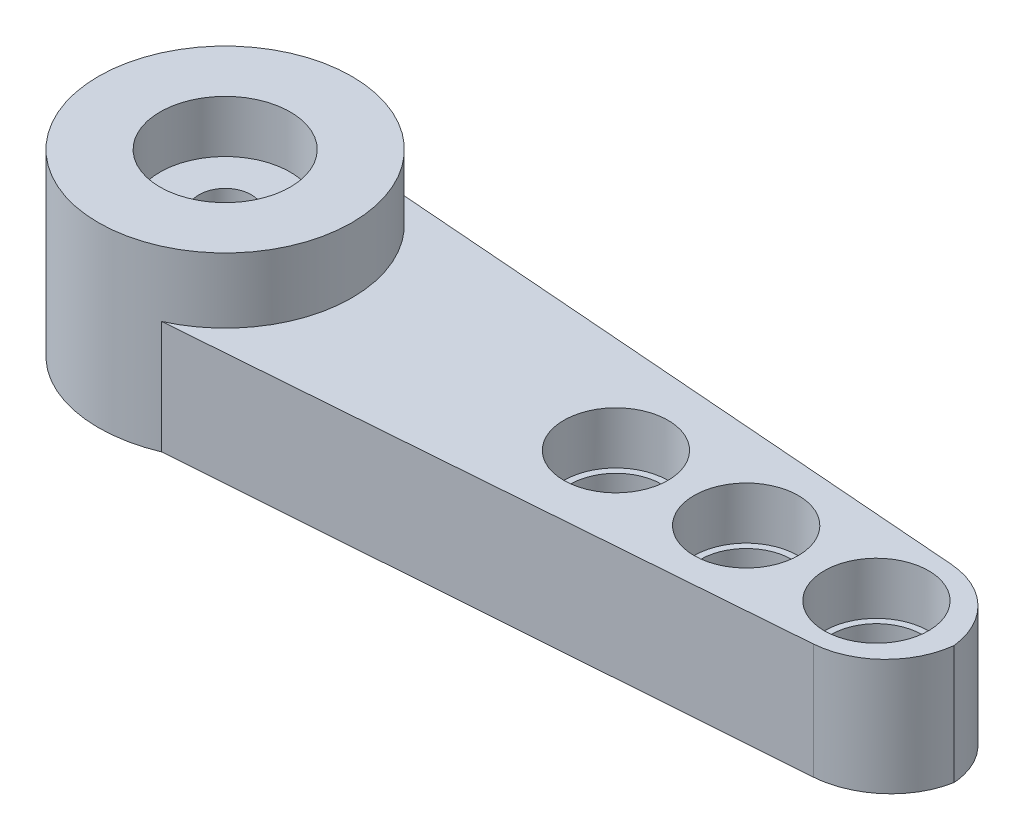
ISO-10303-21;
HEADER;
FILE_DESCRIPTION(('STEP AP214'),'2;1');
FILE_NAME('part.step','',(''),(''),'','','');
FILE_SCHEMA(('AUTOMOTIVE_DESIGN { 1 0 10303 214 1 1 1 1 }'));
ENDSEC;
DATA;
#1=APPLICATION_CONTEXT('core data for automotive mechanical design processes');
#2=APPLICATION_PROTOCOL_DEFINITION('international standard','automotive_design',2000,#1);
#3=PRODUCT_CONTEXT('',#1,'mechanical');
#4=PRODUCT('Part','Part','',(#3));
#5=PRODUCT_RELATED_PRODUCT_CATEGORY('part','',(#4));
#6=PRODUCT_DEFINITION_FORMATION('','',#4);
#7=PRODUCT_DEFINITION_CONTEXT('part definition',#1,'design');
#8=PRODUCT_DEFINITION('design','',#6,#7);
#9=PRODUCT_DEFINITION_SHAPE('','',#8);
#10=(LENGTH_UNIT() NAMED_UNIT(*) SI_UNIT(.MILLI.,.METRE.));
#11=(NAMED_UNIT(*) PLANE_ANGLE_UNIT() SI_UNIT($,.RADIAN.));
#12=(NAMED_UNIT(*) SI_UNIT($,.STERADIAN.) SOLID_ANGLE_UNIT());
#13=UNCERTAINTY_MEASURE_WITH_UNIT(LENGTH_MEASURE(1.E-05),#10,'distance_accuracy_value','');
#14=(GEOMETRIC_REPRESENTATION_CONTEXT(3) GLOBAL_UNCERTAINTY_ASSIGNED_CONTEXT((#13)) GLOBAL_UNIT_ASSIGNED_CONTEXT((#10,
#11,#12)) REPRESENTATION_CONTEXT('',''));
#15=CARTESIAN_POINT('',(0.,0.,0.));
#16=DIRECTION('',(0.,0.,1.));
#17=DIRECTION('',(1.,0.,0.));
#18=AXIS2_PLACEMENT_3D('',#15,#16,#17);
#19=CARTESIAN_POINT('',(0.,3.9,0.));
#20=DIRECTION('',(0.,-1.,0.));
#21=DIRECTION('',(0.,0.,-1.));
#22=AXIS2_PLACEMENT_3D('',#19,#20,#21);
#23=CYLINDRICAL_SURFACE('',#22,1.);
#24=CARTESIAN_POINT('',(0.,1.9,0.));
#25=DIRECTION('',(0.,1.,0.));
#26=DIRECTION('',(0.,0.,1.));
#27=AXIS2_PLACEMENT_3D('',#24,#25,#26);
#28=CIRCLE('',#27,1.);
#29=CARTESIAN_POINT('',(0.,1.9,1.));
#30=VERTEX_POINT('',#29);
#31=EDGE_CURVE('E39',#30,#30,#28,.T.);
#32=ORIENTED_EDGE('',*,*,#31,.T.);
#33=EDGE_LOOP('',(#32));
#34=FACE_BOUND('',#33,.T.);
#35=CARTESIAN_POINT('',(0.,-1.,0.));
#36=DIRECTION('',(0.,-1.,0.));
#37=DIRECTION('',(0.,0.,-1.));
#38=AXIS2_PLACEMENT_3D('',#35,#36,#37);
#39=CIRCLE('',#38,1.);
#40=CARTESIAN_POINT('',(0.,-1.,-1.));
#41=VERTEX_POINT('',#40);
#42=EDGE_CURVE('E468',#41,#41,#39,.T.);
#43=ORIENTED_EDGE('',*,*,#42,.T.);
#44=EDGE_LOOP('',(#43));
#45=FACE_BOUND('',#44,.T.);
#46=ADVANCED_FACE('F35',(#34,#45),#23,.F.);
#47=CARTESIAN_POINT('',(0.,1.,0.));
#48=DIRECTION('',(0.,-1.,0.));
#49=DIRECTION('',(0.,0.,-1.));
#50=AXIS2_PLACEMENT_3D('',#47,#48,#49);
#51=CYLINDRICAL_SURFACE('',#50,2.6);
#52=CARTESIAN_POINT('',(0.,-1.,0.));
#53=DIRECTION('',(0.,-1.,0.));
#54=DIRECTION('',(0.,0.,-1.));
#55=AXIS2_PLACEMENT_3D('',#52,#53,#54);
#56=CIRCLE('',#55,2.6);
#57=CARTESIAN_POINT('',(0.,-1.,-2.6));
#58=VERTEX_POINT('',#57);
#59=EDGE_CURVE('E128',#58,#58,#56,.T.);
#60=ORIENTED_EDGE('',*,*,#59,.F.);
#61=EDGE_LOOP('',(#60));
#62=FACE_BOUND('',#61,.T.);
#63=CARTESIAN_POINT('',(0.,-3.15474202909361,0.));
#64=DIRECTION('',(0.,-0.998806137341434,0.0488497697956134));
#65=DIRECTION('',(0.,-0.0488497697956134,-0.998806137341434));
#66=AXIS2_PLACEMENT_3D('',#63,#64,#65);
#67=ELLIPSE('',#66,2.6031077531427,2.6);
#68=CARTESIAN_POINT('',(0.,-3.28190324358781,-2.6));
#69=VERTEX_POINT('',#68);
#70=EDGE_CURVE('E141',#69,#69,#67,.F.);
#71=ORIENTED_EDGE('',*,*,#70,.F.);
#72=EDGE_LOOP('',(#71));
#73=FACE_BOUND('',#72,.T.);
#74=ADVANCED_FACE('F199',(#62,#73),#51,.F.);
#75=CARTESIAN_POINT('',(0.,17.0446470101297,0.));
#76=DIRECTION('',(0.,-1.,0.));
#77=DIRECTION('',(0.,0.,-1.));
#78=AXIS2_PLACEMENT_3D('',#75,#76,#77);
#79=CYLINDRICAL_SURFACE('',#78,4.86502338951349);
#80=CARTESIAN_POINT('',(0.,-3.15474202909361,0.));
#81=DIRECTION('',(0.,-0.998806137341434,0.0488497697956134));
#82=DIRECTION('',(0.,-0.0488497697956134,-0.998806137341434));
#83=AXIS2_PLACEMENT_3D('',#80,#81,#82);
#84=ELLIPSE('',#83,4.87083850171659,4.86502338951349);
#85=CARTESIAN_POINT('',(1.99999999999999,-3.37164545705108,-4.43491291690302));
#86=VERTEX_POINT('',#85);
#87=CARTESIAN_POINT('',(2.,-2.93783860113616,4.43491291690302));
#88=VERTEX_POINT('',#87);
#89=EDGE_CURVE('E138',#86,#88,#84,.F.);
#90=ORIENTED_EDGE('',*,*,#89,.T.);
#91=DIRECTION('',(0.,-1.,0.));
#92=VECTOR('',#91,1.);
#93=CARTESIAN_POINT('',(2.,28.871327057899,4.43491291690302));
#94=LINE('',#93,#92);
#95=CARTESIAN_POINT('',(2.,1.4,4.43491291690302));
#96=VERTEX_POINT('',#95);
#97=EDGE_CURVE('E158',#96,#88,#94,.T.);
#98=ORIENTED_EDGE('',*,*,#97,.F.);
#99=CARTESIAN_POINT('',(0.,1.4,0.));
#100=DIRECTION('',(0.,1.,0.));
#101=DIRECTION('',(0.,0.,1.));
#102=AXIS2_PLACEMENT_3D('',#99,#100,#101);
#103=CIRCLE('',#102,4.86502338951349);
#104=CARTESIAN_POINT('',(2.,1.4,-4.43491291690302));
#105=VERTEX_POINT('',#104);
#106=EDGE_CURVE('E164',#105,#96,#103,.F.);
#107=ORIENTED_EDGE('',*,*,#106,.F.);
#108=DIRECTION('',(0.,-1.,0.));
#109=VECTOR('',#108,1.);
#110=CARTESIAN_POINT('',(2.,28.871327057899,-4.43491291690302));
#111=LINE('',#110,#109);
#112=EDGE_CURVE('E162',#105,#86,#111,.T.);
#113=ORIENTED_EDGE('',*,*,#112,.T.);
#114=EDGE_LOOP('',(#90,#98,#107,#113));
#115=FACE_BOUND('',#114,.T.);
#116=CARTESIAN_POINT('',(0.,3.9,0.));
#117=DIRECTION('',(0.,1.,0.));
#118=DIRECTION('',(0.,0.,1.));
#119=AXIS2_PLACEMENT_3D('',#116,#117,#118);
#120=CIRCLE('',#119,4.86502338951349);
#121=CARTESIAN_POINT('',(0.,3.9,4.86502338951349));
#122=VERTEX_POINT('',#121);
#123=EDGE_CURVE('E168',#122,#122,#120,.F.);
#124=ORIENTED_EDGE('',*,*,#123,.T.);
#125=EDGE_LOOP('',(#124));
#126=FACE_BOUND('',#125,.T.);
#127=ADVANCED_FACE('F187',(#115,#126),#79,.T.);
#128=CARTESIAN_POINT('',(2.,28.871327057899,4.43491291690302));
#129=DIRECTION('',(0.076696498884737,0.,0.997054485501582));
#130=DIRECTION('',(0.997054485501582,0.,-0.076696498884737));
#131=AXIS2_PLACEMENT_3D('',#128,#129,#130);
#132=PLANE('',#131);
#133=ORIENTED_EDGE('',*,*,#97,.T.);
#134=DIRECTION('',(0.997047470980419,-0.00375105820468159,-0.0766959593061861));
#135=VECTOR('',#134,1.);
#136=CARTESIAN_POINT('',(1.88103425812214,-2.9373910322539,4.44406412781671));
#137=LINE('',#136,#135);
#138=CARTESIAN_POINT('',(25.2300894966542,-3.02523405655638,2.64798295562193));
#139=VERTEX_POINT('',#138);
#140=EDGE_CURVE('E136',#88,#139,#137,.T.);
#141=ORIENTED_EDGE('',*,*,#140,.T.);
#142=DIRECTION('',(0.,-1.,0.));
#143=VECTOR('',#142,1.);
#144=CARTESIAN_POINT('',(25.2300894966542,28.871327057899,2.64798295562193));
#145=LINE('',#144,#143);
#146=CARTESIAN_POINT('',(25.2300894966542,1.4,2.64798295562193));
#147=VERTEX_POINT('',#146);
#148=EDGE_CURVE('E11',#139,#147,#145,.F.);
#149=ORIENTED_EDGE('',*,*,#148,.T.);
#150=DIRECTION('',(-0.997054485501582,0.,0.076696498884737));
#151=VECTOR('',#150,1.);
#152=CARTESIAN_POINT('',(2.,1.4,4.43491291690302));
#153=LINE('',#152,#151);
#154=EDGE_CURVE('E155',#147,#96,#153,.T.);
#155=ORIENTED_EDGE('',*,*,#154,.T.);
#156=EDGE_LOOP('',(#133,#141,#149,#155));
#157=FACE_BOUND('',#156,.T.);
#158=ADVANCED_FACE('F191',(#157),#132,.T.);
#159=CARTESIAN_POINT('',(28.,28.871327057899,-2.43491291690302));
#160=DIRECTION('',(0.076696498884737,0.,-0.997054485501582));
#161=DIRECTION('',(-0.997054485501582,0.,-0.076696498884737));
#162=AXIS2_PLACEMENT_3D('',#159,#160,#161);
#163=PLANE('',#162);
#164=DIRECTION('',(0.,-1.,0.));
#165=VECTOR('',#164,1.);
#166=CARTESIAN_POINT('',(25.2300894966542,28.871327057899,-2.64798295562193));
#167=LINE('',#166,#165);
#168=CARTESIAN_POINT('',(25.2300894966542,1.4,-2.64798295562193));
#169=VERTEX_POINT('',#168);
#170=CARTESIAN_POINT('',(25.2300894966542,-3.28425000163086,-2.64798295562193));
#171=VERTEX_POINT('',#170);
#172=EDGE_CURVE('E171',#169,#171,#167,.T.);
#173=ORIENTED_EDGE('',*,*,#172,.T.);
#174=DIRECTION('',(-0.997047470980419,-0.00375105820468159,-0.0766959593061861));
#175=VECTOR('',#174,1.);
#176=CARTESIAN_POINT('',(28.1202223408071,-3.27337684179322,-2.42566504453325));
#177=LINE('',#176,#175);
#178=EDGE_CURVE('E52',#171,#86,#177,.T.);
#179=ORIENTED_EDGE('',*,*,#178,.T.);
#180=ORIENTED_EDGE('',*,*,#112,.F.);
#181=DIRECTION('',(0.997054485501582,0.,0.076696498884737));
#182=VECTOR('',#181,1.);
#183=CARTESIAN_POINT('',(28.,1.4,-2.43491291690302));
#184=LINE('',#183,#182);
#185=EDGE_CURVE('E159',#105,#169,#184,.T.);
#186=ORIENTED_EDGE('',*,*,#185,.T.);
#187=EDGE_LOOP('',(#173,#179,#180,#186));
#188=FACE_BOUND('',#187,.T.);
#189=ADVANCED_FACE('F185',(#188),#163,.T.);
#190=CARTESIAN_POINT('',(25.,28.871327057899,-0.343180500882815));
#191=DIRECTION('',(0.,-1.,0.));
#192=DIRECTION('',(0.,0.,-1.));
#193=AXIS2_PLACEMENT_3D('',#190,#191,#192);
#194=CYLINDRICAL_SURFACE('',#193,3.);
#195=ORIENTED_EDGE('',*,*,#148,.F.);
#196=CARTESIAN_POINT('',(25.,-3.17152635574093,-0.343180500882815));
#197=DIRECTION('',(0.,-0.998806137341434,0.0488497697956134));
#198=DIRECTION('',(0.,-0.0488497697956134,-0.998806137341434));
#199=AXIS2_PLACEMENT_3D('',#196,#197,#198);
#200=ELLIPSE('',#199,3.00358586901081,3.);
#201=CARTESIAN_POINT('',(27.9803065519865,-3.15474202909363,0.));
#202=VERTEX_POINT('',#201);
#203=EDGE_CURVE('E87',#139,#202,#200,.F.);
#204=ORIENTED_EDGE('',*,*,#203,.T.);
#205=DIRECTION('',(0.,-1.,0.));
#206=VECTOR('',#205,1.);
#207=CARTESIAN_POINT('',(27.9803065519865,0.400000000000001,0.));
#208=LINE('',#207,#206);
#209=CARTESIAN_POINT('',(27.9803065519865,1.4,0.));
#210=VERTEX_POINT('',#209);
#211=EDGE_CURVE('E97',#210,#202,#208,.T.);
#212=ORIENTED_EDGE('',*,*,#211,.F.);
#213=CARTESIAN_POINT('',(25.,1.4,-0.343180500882815));
#214=DIRECTION('',(0.,1.,0.));
#215=DIRECTION('',(0.,0.,1.));
#216=AXIS2_PLACEMENT_3D('',#213,#214,#215);
#217=CIRCLE('',#216,3.);
#218=EDGE_CURVE('E60',#147,#210,#217,.T.);
#219=ORIENTED_EDGE('',*,*,#218,.F.);
#220=EDGE_LOOP('',(#195,#204,#212,#219));
#221=FACE_BOUND('',#220,.T.);
#222=ADVANCED_FACE('F37',(#221),#194,.T.);
#223=CARTESIAN_POINT('',(25.,28.871327057899,0.343180500882815));
#224=DIRECTION('',(0.,-1.,0.));
#225=DIRECTION('',(0.,0.,-1.));
#226=AXIS2_PLACEMENT_3D('',#223,#224,#225);
#227=CYLINDRICAL_SURFACE('',#226,3.);
#228=ORIENTED_EDGE('',*,*,#211,.T.);
#229=CARTESIAN_POINT('',(25.,-3.13795770244632,0.343180500882815));
#230=DIRECTION('',(0.,-0.998806137341434,0.0488497697956134));
#231=DIRECTION('',(0.,-0.0488497697956134,-0.998806137341434));
#232=AXIS2_PLACEMENT_3D('',#229,#230,#231);
#233=ELLIPSE('',#232,3.00358586901081,3.);
#234=EDGE_CURVE('E82',#202,#171,#233,.F.);
#235=ORIENTED_EDGE('',*,*,#234,.T.);
#236=ORIENTED_EDGE('',*,*,#172,.F.);
#237=CARTESIAN_POINT('',(25.,1.4,0.343180500882815));
#238=DIRECTION('',(0.,1.,0.));
#239=DIRECTION('',(0.,0.,1.));
#240=AXIS2_PLACEMENT_3D('',#237,#238,#239);
#241=CIRCLE('',#240,3.);
#242=EDGE_CURVE('E44',#210,#169,#241,.T.);
#243=ORIENTED_EDGE('',*,*,#242,.F.);
#244=EDGE_LOOP('',(#228,#235,#236,#243));
#245=FACE_BOUND('',#244,.T.);
#246=ADVANCED_FACE('F100',(#245),#227,.T.);
#247=CARTESIAN_POINT('',(20.,-3.6,0.));
#248=DIRECTION('',(0.,1.,0.));
#249=DIRECTION('',(0.,0.,1.));
#250=AXIS2_PLACEMENT_3D('',#247,#248,#249);
#251=CYLINDRICAL_SURFACE('',#250,1.75);
#252=CARTESIAN_POINT('',(20.,-0.6,0.));
#253=DIRECTION('',(0.,-1.,0.));
#254=DIRECTION('',(0.,0.,-1.));
#255=AXIS2_PLACEMENT_3D('',#252,#253,#254);
#256=CIRCLE('',#255,1.75);
#257=CARTESIAN_POINT('',(20.,-0.6,-1.75));
#258=VERTEX_POINT('',#257);
#259=EDGE_CURVE('E102',#258,#258,#256,.T.);
#260=ORIENTED_EDGE('',*,*,#259,.F.);
#261=EDGE_LOOP('',(#260));
#262=FACE_BOUND('',#261,.T.);
#263=CARTESIAN_POINT('',(20.,-3.15474202909361,0.));
#264=DIRECTION('',(0.,-0.998806137341434,0.0488497697956134));
#265=DIRECTION('',(0.,0.0488497697956134,0.998806137341434));
#266=AXIS2_PLACEMENT_3D('',#263,#264,#265);
#267=ELLIPSE('',#266,1.75209175692297,1.75);
#268=CARTESIAN_POINT('',(20.,-3.06915275010714,1.75));
#269=VERTEX_POINT('',#268);
#270=EDGE_CURVE('E93',#269,#269,#267,.T.);
#271=ORIENTED_EDGE('',*,*,#270,.T.);
#272=EDGE_LOOP('',(#271));
#273=FACE_BOUND('',#272,.T.);
#274=ADVANCED_FACE('F219',(#262,#273),#251,.F.);
#275=CARTESIAN_POINT('',(15.,-3.6,0.));
#276=DIRECTION('',(0.,1.,0.));
#277=DIRECTION('',(0.,0.,1.));
#278=AXIS2_PLACEMENT_3D('',#275,#276,#277);
#279=CYLINDRICAL_SURFACE('',#278,1.75);
#280=CARTESIAN_POINT('',(15.,-0.6,0.));
#281=DIRECTION('',(0.,-1.,0.));
#282=DIRECTION('',(0.,0.,-1.));
#283=AXIS2_PLACEMENT_3D('',#280,#281,#282);
#284=CIRCLE('',#283,1.75);
#285=CARTESIAN_POINT('',(15.,-0.6,-1.75));
#286=VERTEX_POINT('',#285);
#287=EDGE_CURVE('E108',#286,#286,#284,.T.);
#288=ORIENTED_EDGE('',*,*,#287,.F.);
#289=EDGE_LOOP('',(#288));
#290=FACE_BOUND('',#289,.T.);
#291=CARTESIAN_POINT('',(15.,-3.15474202909361,0.));
#292=DIRECTION('',(0.,-0.998806137341434,0.0488497697956134));
#293=DIRECTION('',(0.,0.0488497697956134,0.998806137341434));
#294=AXIS2_PLACEMENT_3D('',#291,#292,#293);
#295=ELLIPSE('',#294,1.75209175692297,1.75);
#296=CARTESIAN_POINT('',(15.,-3.06915275010714,1.75));
#297=VERTEX_POINT('',#296);
#298=EDGE_CURVE('E113',#297,#297,#295,.T.);
#299=ORIENTED_EDGE('',*,*,#298,.T.);
#300=EDGE_LOOP('',(#299));
#301=FACE_BOUND('',#300,.T.);
#302=ADVANCED_FACE('F224',(#290,#301),#279,.F.);
#303=CARTESIAN_POINT('',(25.,-3.6,0.));
#304=DIRECTION('',(0.,1.,0.));
#305=DIRECTION('',(0.,0.,1.));
#306=AXIS2_PLACEMENT_3D('',#303,#304,#305);
#307=CYLINDRICAL_SURFACE('',#306,1.75);
#308=CARTESIAN_POINT('',(25.,-0.6,0.));
#309=DIRECTION('',(0.,-1.,0.));
#310=DIRECTION('',(0.,0.,-1.));
#311=AXIS2_PLACEMENT_3D('',#308,#309,#310);
#312=CIRCLE('',#311,1.75);
#313=CARTESIAN_POINT('',(25.,-0.6,-1.75));
#314=VERTEX_POINT('',#313);
#315=EDGE_CURVE('E144',#314,#314,#312,.T.);
#316=ORIENTED_EDGE('',*,*,#315,.F.);
#317=EDGE_LOOP('',(#316));
#318=FACE_BOUND('',#317,.T.);
#319=CARTESIAN_POINT('',(25.,-3.15474202909361,0.));
#320=DIRECTION('',(0.,-0.998806137341434,0.0488497697956134));
#321=DIRECTION('',(0.,0.0488497697956134,0.998806137341434));
#322=AXIS2_PLACEMENT_3D('',#319,#320,#321);
#323=ELLIPSE('',#322,1.75209175692297,1.75);
#324=CARTESIAN_POINT('',(25.,-3.06915275010714,1.75));
#325=VERTEX_POINT('',#324);
#326=EDGE_CURVE('E111',#325,#325,#323,.T.);
#327=ORIENTED_EDGE('',*,*,#326,.T.);
#328=EDGE_LOOP('',(#327));
#329=FACE_BOUND('',#328,.T.);
#330=ADVANCED_FACE('F217',(#318,#329),#307,.F.);
#331=CARTESIAN_POINT('',(-15.2,1.4,0.));
#332=DIRECTION('',(0.,1.,0.));
#333=DIRECTION('',(0.,0.,1.));
#334=AXIS2_PLACEMENT_3D('',#331,#332,#333);
#335=PLANE('',#334);
#336=ORIENTED_EDGE('',*,*,#106,.T.);
#337=ORIENTED_EDGE('',*,*,#154,.F.);
#338=ORIENTED_EDGE('',*,*,#218,.T.);
#339=ORIENTED_EDGE('',*,*,#242,.T.);
#340=ORIENTED_EDGE('',*,*,#185,.F.);
#341=EDGE_LOOP('',(#336,#337,#338,#339,#340));
#342=FACE_BOUND('',#341,.T.);
#343=CARTESIAN_POINT('',(15.,1.4,0.));
#344=DIRECTION('',(0.,1.,0.));
#345=DIRECTION('',(0.,0.,1.));
#346=AXIS2_PLACEMENT_3D('',#343,#344,#345);
#347=CIRCLE('',#346,2.);
#348=CARTESIAN_POINT('',(15.,1.4,2.));
#349=VERTEX_POINT('',#348);
#350=EDGE_CURVE('E149',#349,#349,#347,.F.);
#351=ORIENTED_EDGE('',*,*,#350,.T.);
#352=EDGE_LOOP('',(#351));
#353=FACE_BOUND('',#352,.T.);
#354=CARTESIAN_POINT('',(25.,1.4,0.));
#355=DIRECTION('',(0.,1.,0.));
#356=DIRECTION('',(0.,0.,1.));
#357=AXIS2_PLACEMENT_3D('',#354,#355,#356);
#358=CIRCLE('',#357,2.);
#359=CARTESIAN_POINT('',(25.,1.4,2.));
#360=VERTEX_POINT('',#359);
#361=EDGE_CURVE('E105',#360,#360,#358,.F.);
#362=ORIENTED_EDGE('',*,*,#361,.T.);
#363=EDGE_LOOP('',(#362));
#364=FACE_BOUND('',#363,.T.);
#365=CARTESIAN_POINT('',(20.,1.4,0.));
#366=DIRECTION('',(0.,1.,0.));
#367=DIRECTION('',(0.,0.,1.));
#368=AXIS2_PLACEMENT_3D('',#365,#366,#367);
#369=CIRCLE('',#368,2.);
#370=CARTESIAN_POINT('',(20.,1.4,2.));
#371=VERTEX_POINT('',#370);
#372=EDGE_CURVE('E101',#371,#371,#369,.F.);
#373=ORIENTED_EDGE('',*,*,#372,.T.);
#374=EDGE_LOOP('',(#373));
#375=FACE_BOUND('',#374,.T.);
#376=ADVANCED_FACE('F181',(#342,#353,#364,#375),#335,.T.);
#377=CARTESIAN_POINT('',(0.,3.9,0.));
#378=DIRECTION('',(0.,1.,0.));
#379=DIRECTION('',(0.,0.,1.));
#380=AXIS2_PLACEMENT_3D('',#377,#378,#379);
#381=PLANE('',#380);
#382=CARTESIAN_POINT('',(0.,3.9,0.));
#383=DIRECTION('',(0.,1.,0.));
#384=DIRECTION('',(0.,0.,1.));
#385=AXIS2_PLACEMENT_3D('',#382,#383,#384);
#386=CIRCLE('',#385,2.5);
#387=CARTESIAN_POINT('',(0.,3.9,2.5));
#388=VERTEX_POINT('',#387);
#389=EDGE_CURVE('E123',#388,#388,#386,.T.);
#390=ORIENTED_EDGE('',*,*,#389,.F.);
#391=EDGE_LOOP('',(#390));
#392=FACE_BOUND('',#391,.T.);
#393=ORIENTED_EDGE('',*,*,#123,.F.);
#394=EDGE_LOOP('',(#393));
#395=FACE_BOUND('',#394,.T.);
#396=ADVANCED_FACE('F211',(#392,#395),#381,.T.);
#397=CARTESIAN_POINT('',(20.,-10.6,0.));
#398=DIRECTION('',(0.,1.,0.));
#399=DIRECTION('',(0.,0.,1.));
#400=AXIS2_PLACEMENT_3D('',#397,#398,#399);
#401=CYLINDRICAL_SURFACE('',#400,2.);
#402=CARTESIAN_POINT('',(20.,-0.6,0.));
#403=DIRECTION('',(0.,-1.,0.));
#404=DIRECTION('',(0.,0.,-1.));
#405=AXIS2_PLACEMENT_3D('',#402,#403,#404);
#406=CIRCLE('',#405,2.);
#407=CARTESIAN_POINT('',(20.,-0.6,-2.));
#408=VERTEX_POINT('',#407);
#409=EDGE_CURVE('E152',#408,#408,#406,.F.);
#410=ORIENTED_EDGE('',*,*,#409,.F.);
#411=EDGE_LOOP('',(#410));
#412=FACE_BOUND('',#411,.T.);
#413=ORIENTED_EDGE('',*,*,#372,.F.);
#414=EDGE_LOOP('',(#413));
#415=FACE_BOUND('',#414,.T.);
#416=ADVANCED_FACE('F213',(#412,#415),#401,.F.);
#417=CARTESIAN_POINT('',(25.,-10.6,0.));
#418=DIRECTION('',(0.,1.,0.));
#419=DIRECTION('',(0.,0.,1.));
#420=AXIS2_PLACEMENT_3D('',#417,#418,#419);
#421=CYLINDRICAL_SURFACE('',#420,2.);
#422=CARTESIAN_POINT('',(25.,-0.6,0.));
#423=DIRECTION('',(0.,-1.,0.));
#424=DIRECTION('',(0.,0.,-1.));
#425=AXIS2_PLACEMENT_3D('',#422,#423,#424);
#426=CIRCLE('',#425,2.);
#427=CARTESIAN_POINT('',(25.,-0.6,-2.));
#428=VERTEX_POINT('',#427);
#429=EDGE_CURVE('E174',#428,#428,#426,.F.);
#430=ORIENTED_EDGE('',*,*,#429,.F.);
#431=EDGE_LOOP('',(#430));
#432=FACE_BOUND('',#431,.T.);
#433=ORIENTED_EDGE('',*,*,#361,.F.);
#434=EDGE_LOOP('',(#433));
#435=FACE_BOUND('',#434,.T.);
#436=ADVANCED_FACE('F315',(#432,#435),#421,.F.);
#437=CARTESIAN_POINT('',(15.,-10.6,0.));
#438=DIRECTION('',(0.,1.,0.));
#439=DIRECTION('',(0.,0.,1.));
#440=AXIS2_PLACEMENT_3D('',#437,#438,#439);
#441=CYLINDRICAL_SURFACE('',#440,2.);
#442=CARTESIAN_POINT('',(15.,-0.6,0.));
#443=DIRECTION('',(0.,-1.,0.));
#444=DIRECTION('',(0.,0.,-1.));
#445=AXIS2_PLACEMENT_3D('',#442,#443,#444);
#446=CIRCLE('',#445,2.);
#447=CARTESIAN_POINT('',(15.,-0.6,-2.));
#448=VERTEX_POINT('',#447);
#449=EDGE_CURVE('E166',#448,#448,#446,.F.);
#450=ORIENTED_EDGE('',*,*,#449,.F.);
#451=EDGE_LOOP('',(#450));
#452=FACE_BOUND('',#451,.T.);
#453=ORIENTED_EDGE('',*,*,#350,.F.);
#454=EDGE_LOOP('',(#453));
#455=FACE_BOUND('',#454,.T.);
#456=ADVANCED_FACE('F311',(#452,#455),#441,.F.);
#457=CARTESIAN_POINT('',(0.,-0.6,0.));
#458=DIRECTION('',(0.,-1.,0.));
#459=DIRECTION('',(0.,0.,-1.));
#460=AXIS2_PLACEMENT_3D('',#457,#458,#459);
#461=PLANE('',#460);
#462=ORIENTED_EDGE('',*,*,#287,.T.);
#463=EDGE_LOOP('',(#462));
#464=FACE_BOUND('',#463,.T.);
#465=ORIENTED_EDGE('',*,*,#449,.T.);
#466=EDGE_LOOP('',(#465));
#467=FACE_BOUND('',#466,.T.);
#468=ADVANCED_FACE('F307',(#464,#467),#461,.F.);
#469=ORIENTED_EDGE('',*,*,#315,.T.);
#470=EDGE_LOOP('',(#469));
#471=FACE_BOUND('',#470,.T.);
#472=ORIENTED_EDGE('',*,*,#429,.T.);
#473=EDGE_LOOP('',(#472));
#474=FACE_BOUND('',#473,.T.);
#475=ADVANCED_FACE('F310',(#471,#474),#461,.F.);
#476=ORIENTED_EDGE('',*,*,#259,.T.);
#477=EDGE_LOOP('',(#476));
#478=FACE_BOUND('',#477,.T.);
#479=ORIENTED_EDGE('',*,*,#409,.T.);
#480=EDGE_LOOP('',(#479));
#481=FACE_BOUND('',#480,.T.);
#482=ADVANCED_FACE('F300',(#478,#481),#461,.F.);
#483=CARTESIAN_POINT('',(0.,-3.14721386816093,0.153924437595509));
#484=DIRECTION('',(0.,-0.998806137341434,0.0488497697956134));
#485=DIRECTION('',(0.,-0.0488497697956134,-0.998806137341434));
#486=AXIS2_PLACEMENT_3D('',#483,#484,#485);
#487=PLANE('',#486);
#488=ORIENTED_EDGE('',*,*,#178,.F.);
#489=ORIENTED_EDGE('',*,*,#234,.F.);
#490=ORIENTED_EDGE('',*,*,#203,.F.);
#491=ORIENTED_EDGE('',*,*,#140,.F.);
#492=ORIENTED_EDGE('',*,*,#89,.F.);
#493=EDGE_LOOP('',(#488,#489,#490,#491,#492));
#494=FACE_BOUND('',#493,.T.);
#495=ORIENTED_EDGE('',*,*,#270,.F.);
#496=EDGE_LOOP('',(#495));
#497=FACE_BOUND('',#496,.T.);
#498=ORIENTED_EDGE('',*,*,#298,.F.);
#499=EDGE_LOOP('',(#498));
#500=FACE_BOUND('',#499,.T.);
#501=ORIENTED_EDGE('',*,*,#326,.F.);
#502=EDGE_LOOP('',(#501));
#503=FACE_BOUND('',#502,.T.);
#504=ORIENTED_EDGE('',*,*,#70,.T.);
#505=EDGE_LOOP('',(#504));
#506=FACE_BOUND('',#505,.T.);
#507=ADVANCED_FACE('F84',(#494,#497,#500,#503,#506),#487,.T.);
#508=CARTESIAN_POINT('',(0.,1.9,0.));
#509=DIRECTION('',(0.,1.,0.));
#510=DIRECTION('',(0.,0.,1.));
#511=AXIS2_PLACEMENT_3D('',#508,#509,#510);
#512=CYLINDRICAL_SURFACE('',#511,2.5);
#513=CARTESIAN_POINT('',(0.,1.9,0.));
#514=DIRECTION('',(0.,1.,0.));
#515=DIRECTION('',(0.,0.,1.));
#516=AXIS2_PLACEMENT_3D('',#513,#514,#515);
#517=CIRCLE('',#516,2.5);
#518=CARTESIAN_POINT('',(0.,1.9,2.5));
#519=VERTEX_POINT('',#518);
#520=EDGE_CURVE('E119',#519,#519,#517,.T.);
#521=ORIENTED_EDGE('',*,*,#520,.F.);
#522=EDGE_LOOP('',(#521));
#523=FACE_BOUND('',#522,.T.);
#524=ORIENTED_EDGE('',*,*,#389,.T.);
#525=EDGE_LOOP('',(#524));
#526=FACE_BOUND('',#525,.T.);
#527=ADVANCED_FACE('F254',(#523,#526),#512,.F.);
#528=CARTESIAN_POINT('',(0.,1.9,0.));
#529=DIRECTION('',(0.,1.,0.));
#530=DIRECTION('',(0.,0.,1.));
#531=AXIS2_PLACEMENT_3D('',#528,#529,#530);
#532=PLANE('',#531);
#533=ORIENTED_EDGE('',*,*,#31,.F.);
#534=EDGE_LOOP('',(#533));
#535=FACE_BOUND('',#534,.T.);
#536=ORIENTED_EDGE('',*,*,#520,.T.);
#537=EDGE_LOOP('',(#536));
#538=FACE_BOUND('',#537,.T.);
#539=ADVANCED_FACE('F259',(#535,#538),#532,.T.);
#540=CARTESIAN_POINT('',(0.,-1.,0.));
#541=DIRECTION('',(0.,-1.,0.));
#542=DIRECTION('',(0.,0.,-1.));
#543=AXIS2_PLACEMENT_3D('',#540,#541,#542);
#544=PLANE('',#543);
#545=ORIENTED_EDGE('',*,*,#59,.T.);
#546=EDGE_LOOP('',(#545));
#547=FACE_BOUND('',#546,.T.);
#548=ORIENTED_EDGE('',*,*,#42,.F.);
#549=EDGE_LOOP('',(#548));
#550=FACE_BOUND('',#549,.T.);
#551=ADVANCED_FACE('F270',(#547,#550),#544,.T.);
#552=CLOSED_SHELL('',(#46,#74,#127,#158,#189,#222,#246,#274,#302,#330,#376,#396,#416,#436,#456,
#468,#475,#482,#507,#527,#539,#551));
#553=MANIFOLD_SOLID_BREP('B2',#552);
#554=ADVANCED_BREP_SHAPE_REPRESENTATION('',(#18,#553),#14);
#555=SHAPE_DEFINITION_REPRESENTATION(#9,#554);
ENDSEC;
END-ISO-10303-21;
